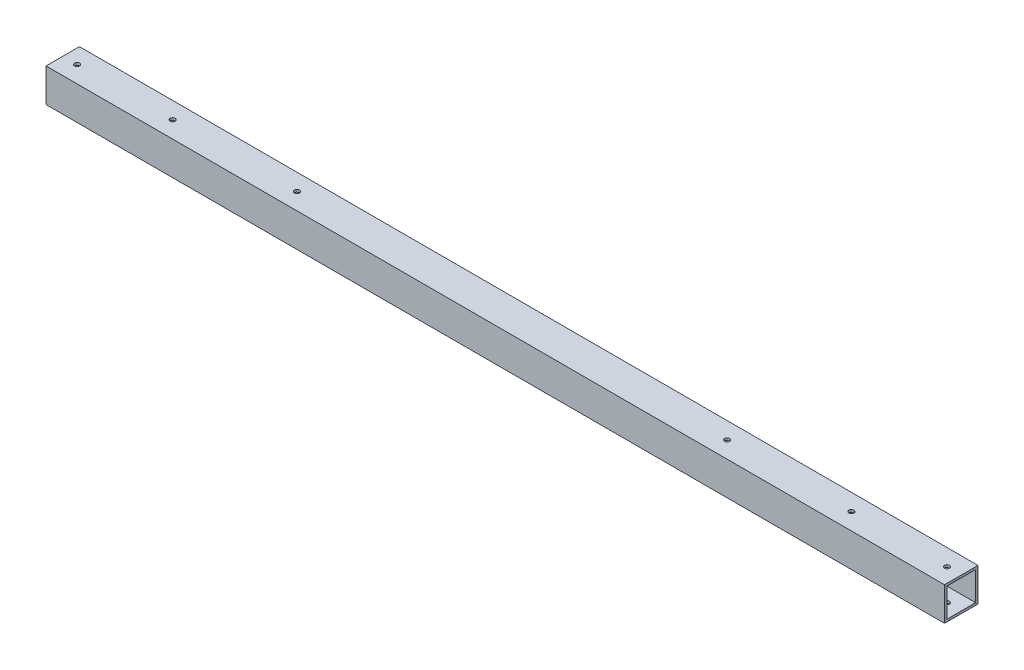
ISO-10303-21;
HEADER;
FILE_DESCRIPTION(('STEP AP214'),'2;1');
FILE_NAME('part.step','',(''),(''),'','','');
FILE_SCHEMA(('AUTOMOTIVE_DESIGN { 1 0 10303 214 1 1 1 1 }'));
ENDSEC;
DATA;
#1=APPLICATION_CONTEXT('core data for automotive mechanical design processes');
#2=APPLICATION_PROTOCOL_DEFINITION('international standard','automotive_design',2000,#1);
#3=PRODUCT_CONTEXT('',#1,'mechanical');
#4=PRODUCT('Part','Part','',(#3));
#5=PRODUCT_RELATED_PRODUCT_CATEGORY('part','',(#4));
#6=PRODUCT_DEFINITION_FORMATION('','',#4);
#7=PRODUCT_DEFINITION_CONTEXT('part definition',#1,'design');
#8=PRODUCT_DEFINITION('design','',#6,#7);
#9=PRODUCT_DEFINITION_SHAPE('','',#8);
#10=(LENGTH_UNIT() NAMED_UNIT(*) SI_UNIT(.MILLI.,.METRE.));
#11=(NAMED_UNIT(*) PLANE_ANGLE_UNIT() SI_UNIT($,.RADIAN.));
#12=(NAMED_UNIT(*) SI_UNIT($,.STERADIAN.) SOLID_ANGLE_UNIT());
#13=UNCERTAINTY_MEASURE_WITH_UNIT(LENGTH_MEASURE(1.E-05),#10,'distance_accuracy_value','');
#14=(GEOMETRIC_REPRESENTATION_CONTEXT(3) GLOBAL_UNCERTAINTY_ASSIGNED_CONTEXT((#13)) GLOBAL_UNIT_ASSIGNED_CONTEXT((#10,
#11,#12)) REPRESENTATION_CONTEXT('',''));
#15=CARTESIAN_POINT('',(0.,0.,0.));
#16=DIRECTION('',(0.,0.,1.));
#17=DIRECTION('',(1.,0.,0.));
#18=AXIS2_PLACEMENT_3D('',#15,#16,#17);
#19=CARTESIAN_POINT('',(1193.8,0.,0.));
#20=DIRECTION('',(-1.,0.,0.));
#21=DIRECTION('',(0.,0.,1.));
#22=AXIS2_PLACEMENT_3D('',#19,#20,#21);
#23=PLANE('',#22);
#24=DIRECTION('',(0.,1.,0.));
#25=VECTOR('',#24,1.);
#26=CARTESIAN_POINT('',(1193.8,-22.225,-22.225));
#27=LINE('',#26,#25);
#28=CARTESIAN_POINT('',(1193.8,-22.225,-22.225));
#29=VERTEX_POINT('',#28);
#30=CARTESIAN_POINT('',(1193.8,22.225,-22.225));
#31=VERTEX_POINT('',#30);
#32=EDGE_CURVE('E140',#29,#31,#27,.T.);
#33=ORIENTED_EDGE('',*,*,#32,.T.);
#34=DIRECTION('',(0.,0.,1.));
#35=VECTOR('',#34,1.);
#36=CARTESIAN_POINT('',(1193.8,22.225,22.225));
#37=LINE('',#36,#35);
#38=CARTESIAN_POINT('',(1193.8,22.225,22.225));
#39=VERTEX_POINT('',#38);
#40=EDGE_CURVE('E143',#31,#39,#37,.T.);
#41=ORIENTED_EDGE('',*,*,#40,.T.);
#42=DIRECTION('',(0.,-1.,0.));
#43=VECTOR('',#42,1.);
#44=CARTESIAN_POINT('',(1193.8,-22.225,22.225));
#45=LINE('',#44,#43);
#46=CARTESIAN_POINT('',(1193.8,-22.225,22.225));
#47=VERTEX_POINT('',#46);
#48=EDGE_CURVE('E146',#39,#47,#45,.T.);
#49=ORIENTED_EDGE('',*,*,#48,.T.);
#50=DIRECTION('',(0.,0.,-1.));
#51=VECTOR('',#50,1.);
#52=CARTESIAN_POINT('',(1193.8,-22.225,22.225));
#53=LINE('',#52,#51);
#54=EDGE_CURVE('E148',#47,#29,#53,.T.);
#55=ORIENTED_EDGE('',*,*,#54,.T.);
#56=EDGE_LOOP('',(#33,#41,#49,#55));
#57=FACE_BOUND('',#56,.T.);
#58=DIRECTION('',(0.,-1.,0.));
#59=VECTOR('',#58,1.);
#60=CARTESIAN_POINT('',(1193.8,-19.05,19.05));
#61=LINE('',#60,#59);
#62=CARTESIAN_POINT('',(1193.8,19.05,19.05));
#63=VERTEX_POINT('',#62);
#64=CARTESIAN_POINT('',(1193.8,-19.05,19.05));
#65=VERTEX_POINT('',#64);
#66=EDGE_CURVE('E102',#63,#65,#61,.T.);
#67=ORIENTED_EDGE('',*,*,#66,.F.);
#68=DIRECTION('',(0.,0.,1.));
#69=VECTOR('',#68,1.);
#70=CARTESIAN_POINT('',(1193.8,19.05,19.05));
#71=LINE('',#70,#69);
#72=CARTESIAN_POINT('',(1193.8,19.05,-19.05));
#73=VERTEX_POINT('',#72);
#74=EDGE_CURVE('E124',#73,#63,#71,.T.);
#75=ORIENTED_EDGE('',*,*,#74,.F.);
#76=DIRECTION('',(0.,1.,0.));
#77=VECTOR('',#76,1.);
#78=CARTESIAN_POINT('',(1193.8,-19.05,-19.05));
#79=LINE('',#78,#77);
#80=CARTESIAN_POINT('',(1193.8,-19.05,-19.05));
#81=VERTEX_POINT('',#80);
#82=EDGE_CURVE('E122',#81,#73,#79,.T.);
#83=ORIENTED_EDGE('',*,*,#82,.F.);
#84=DIRECTION('',(0.,0.,-1.));
#85=VECTOR('',#84,1.);
#86=CARTESIAN_POINT('',(1193.8,-19.05,19.05));
#87=LINE('',#86,#85);
#88=EDGE_CURVE('E110',#65,#81,#87,.T.);
#89=ORIENTED_EDGE('',*,*,#88,.F.);
#90=EDGE_LOOP('',(#67,#75,#83,#89));
#91=FACE_BOUND('',#90,.T.);
#92=ADVANCED_FACE('F35',(#57,#91),#23,.F.);
#93=CARTESIAN_POINT('',(0.,0.,0.));
#94=DIRECTION('',(-1.,0.,0.));
#95=DIRECTION('',(0.,0.,1.));
#96=AXIS2_PLACEMENT_3D('',#93,#94,#95);
#97=PLANE('',#96);
#98=DIRECTION('',(0.,1.,0.));
#99=VECTOR('',#98,1.);
#100=CARTESIAN_POINT('',(0.,-22.225,-22.225));
#101=LINE('',#100,#99);
#102=CARTESIAN_POINT('',(0.,-22.225,-22.225));
#103=VERTEX_POINT('',#102);
#104=CARTESIAN_POINT('',(0.,22.225,-22.225));
#105=VERTEX_POINT('',#104);
#106=EDGE_CURVE('E118',#103,#105,#101,.T.);
#107=ORIENTED_EDGE('',*,*,#106,.F.);
#108=DIRECTION('',(0.,0.,-1.));
#109=VECTOR('',#108,1.);
#110=CARTESIAN_POINT('',(0.,-22.225,22.225));
#111=LINE('',#110,#109);
#112=CARTESIAN_POINT('',(0.,-22.225,22.225));
#113=VERTEX_POINT('',#112);
#114=EDGE_CURVE('E144',#113,#103,#111,.T.);
#115=ORIENTED_EDGE('',*,*,#114,.F.);
#116=DIRECTION('',(0.,-1.,0.));
#117=VECTOR('',#116,1.);
#118=CARTESIAN_POINT('',(0.,-22.225,22.225));
#119=LINE('',#118,#117);
#120=CARTESIAN_POINT('',(0.,22.225,22.225));
#121=VERTEX_POINT('',#120);
#122=EDGE_CURVE('E155',#121,#113,#119,.T.);
#123=ORIENTED_EDGE('',*,*,#122,.F.);
#124=DIRECTION('',(0.,0.,1.));
#125=VECTOR('',#124,1.);
#126=CARTESIAN_POINT('',(0.,22.225,22.225));
#127=LINE('',#126,#125);
#128=EDGE_CURVE('E153',#105,#121,#127,.T.);
#129=ORIENTED_EDGE('',*,*,#128,.F.);
#130=EDGE_LOOP('',(#107,#115,#123,#129));
#131=FACE_BOUND('',#130,.T.);
#132=DIRECTION('',(0.,0.,1.));
#133=VECTOR('',#132,1.);
#134=CARTESIAN_POINT('',(0.,19.05,19.05));
#135=LINE('',#134,#133);
#136=CARTESIAN_POINT('',(0.,19.05,-19.05));
#137=VERTEX_POINT('',#136);
#138=CARTESIAN_POINT('',(0.,19.05,19.05));
#139=VERTEX_POINT('',#138);
#140=EDGE_CURVE('E111',#137,#139,#135,.T.);
#141=ORIENTED_EDGE('',*,*,#140,.T.);
#142=DIRECTION('',(0.,-1.,0.));
#143=VECTOR('',#142,1.);
#144=CARTESIAN_POINT('',(0.,-19.05,19.05));
#145=LINE('',#144,#143);
#146=CARTESIAN_POINT('',(0.,-19.05,19.05));
#147=VERTEX_POINT('',#146);
#148=EDGE_CURVE('E60',#139,#147,#145,.T.);
#149=ORIENTED_EDGE('',*,*,#148,.T.);
#150=DIRECTION('',(0.,0.,-1.));
#151=VECTOR('',#150,1.);
#152=CARTESIAN_POINT('',(0.,-19.05,19.05));
#153=LINE('',#152,#151);
#154=CARTESIAN_POINT('',(0.,-19.05,-19.05));
#155=VERTEX_POINT('',#154);
#156=EDGE_CURVE('E117',#147,#155,#153,.T.);
#157=ORIENTED_EDGE('',*,*,#156,.T.);
#158=DIRECTION('',(0.,1.,0.));
#159=VECTOR('',#158,1.);
#160=CARTESIAN_POINT('',(0.,-19.05,-19.05));
#161=LINE('',#160,#159);
#162=EDGE_CURVE('E132',#155,#137,#161,.T.);
#163=ORIENTED_EDGE('',*,*,#162,.T.);
#164=EDGE_LOOP('',(#141,#149,#157,#163));
#165=FACE_BOUND('',#164,.T.);
#166=ADVANCED_FACE('F239',(#131,#165),#97,.T.);
#167=CARTESIAN_POINT('',(1193.8,-22.225,-22.225));
#168=DIRECTION('',(0.,0.,1.));
#169=DIRECTION('',(1.,0.,0.));
#170=AXIS2_PLACEMENT_3D('',#167,#168,#169);
#171=PLANE('',#170);
#172=ORIENTED_EDGE('',*,*,#106,.T.);
#173=DIRECTION('',(-1.,0.,0.));
#174=VECTOR('',#173,1.);
#175=CARTESIAN_POINT('',(1193.8,22.225,-22.225));
#176=LINE('',#175,#174);
#177=EDGE_CURVE('E11',#31,#105,#176,.T.);
#178=ORIENTED_EDGE('',*,*,#177,.F.);
#179=ORIENTED_EDGE('',*,*,#32,.F.);
#180=DIRECTION('',(-1.,0.,0.));
#181=VECTOR('',#180,1.);
#182=CARTESIAN_POINT('',(1193.8,-22.225,-22.225));
#183=LINE('',#182,#181);
#184=EDGE_CURVE('E150',#29,#103,#183,.T.);
#185=ORIENTED_EDGE('',*,*,#184,.T.);
#186=EDGE_LOOP('',(#172,#178,#179,#185));
#187=FACE_BOUND('',#186,.T.);
#188=ADVANCED_FACE('F37',(#187),#171,.F.);
#189=CARTESIAN_POINT('',(1193.8,22.225,22.225));
#190=DIRECTION('',(0.,-1.,0.));
#191=DIRECTION('',(0.,0.,-1.));
#192=AXIS2_PLACEMENT_3D('',#189,#190,#191);
#193=PLANE('',#192);
#194=CARTESIAN_POINT('',(311.15,22.225,0.));
#195=DIRECTION('',(0.,1.,0.));
#196=DIRECTION('',(0.,0.,1.));
#197=AXIS2_PLACEMENT_3D('',#194,#195,#196);
#198=CIRCLE('',#197,3.3782);
#199=CARTESIAN_POINT('',(311.15,22.225,3.3782));
#200=VERTEX_POINT('',#199);
#201=EDGE_CURVE('E275',#200,#200,#198,.T.);
#202=ORIENTED_EDGE('',*,*,#201,.F.);
#203=EDGE_LOOP('',(#202));
#204=FACE_BOUND('',#203,.T.);
#205=CARTESIAN_POINT('',(146.05,22.225,0.));
#206=DIRECTION('',(0.,1.,0.));
#207=DIRECTION('',(0.,0.,1.));
#208=AXIS2_PLACEMENT_3D('',#205,#206,#207);
#209=CIRCLE('',#208,3.3782);
#210=CARTESIAN_POINT('',(146.05,22.225,3.3782));
#211=VERTEX_POINT('',#210);
#212=EDGE_CURVE('E189',#211,#211,#209,.T.);
#213=ORIENTED_EDGE('',*,*,#212,.F.);
#214=EDGE_LOOP('',(#213));
#215=FACE_BOUND('',#214,.T.);
#216=CARTESIAN_POINT('',(19.05,22.225,0.));
#217=DIRECTION('',(0.,1.,0.));
#218=DIRECTION('',(0.,0.,1.));
#219=AXIS2_PLACEMENT_3D('',#216,#217,#218);
#220=CIRCLE('',#219,3.3782);
#221=CARTESIAN_POINT('',(19.05,22.225,3.3782));
#222=VERTEX_POINT('',#221);
#223=EDGE_CURVE('E186',#222,#222,#220,.T.);
#224=ORIENTED_EDGE('',*,*,#223,.F.);
#225=EDGE_LOOP('',(#224));
#226=FACE_BOUND('',#225,.T.);
#227=CARTESIAN_POINT('',(1174.75,22.225,0.));
#228=DIRECTION('',(0.,1.,0.));
#229=DIRECTION('',(0.,0.,1.));
#230=AXIS2_PLACEMENT_3D('',#227,#228,#229);
#231=CIRCLE('',#230,3.3782);
#232=CARTESIAN_POINT('',(1174.75,22.225,3.3782));
#233=VERTEX_POINT('',#232);
#234=EDGE_CURVE('E204',#233,#233,#231,.T.);
#235=ORIENTED_EDGE('',*,*,#234,.F.);
#236=EDGE_LOOP('',(#235));
#237=FACE_BOUND('',#236,.T.);
#238=CARTESIAN_POINT('',(1047.75,22.225,0.));
#239=DIRECTION('',(0.,1.,0.));
#240=DIRECTION('',(0.,0.,1.));
#241=AXIS2_PLACEMENT_3D('',#238,#239,#240);
#242=CIRCLE('',#241,3.3782);
#243=CARTESIAN_POINT('',(1047.75,22.225,3.3782));
#244=VERTEX_POINT('',#243);
#245=EDGE_CURVE('E211',#244,#244,#242,.T.);
#246=ORIENTED_EDGE('',*,*,#245,.F.);
#247=EDGE_LOOP('',(#246));
#248=FACE_BOUND('',#247,.T.);
#249=CARTESIAN_POINT('',(882.65,22.225,0.));
#250=DIRECTION('',(0.,1.,0.));
#251=DIRECTION('',(0.,0.,1.));
#252=AXIS2_PLACEMENT_3D('',#249,#250,#251);
#253=CIRCLE('',#252,3.3782);
#254=CARTESIAN_POINT('',(882.65,22.225,3.3782));
#255=VERTEX_POINT('',#254);
#256=EDGE_CURVE('E218',#255,#255,#253,.T.);
#257=ORIENTED_EDGE('',*,*,#256,.F.);
#258=EDGE_LOOP('',(#257));
#259=FACE_BOUND('',#258,.T.);
#260=ORIENTED_EDGE('',*,*,#128,.T.);
#261=DIRECTION('',(-1.,0.,0.));
#262=VECTOR('',#261,1.);
#263=CARTESIAN_POINT('',(1193.8,22.225,22.225));
#264=LINE('',#263,#262);
#265=EDGE_CURVE('E44',#39,#121,#264,.T.);
#266=ORIENTED_EDGE('',*,*,#265,.F.);
#267=ORIENTED_EDGE('',*,*,#40,.F.);
#268=ORIENTED_EDGE('',*,*,#177,.T.);
#269=EDGE_LOOP('',(#260,#266,#267,#268));
#270=FACE_BOUND('',#269,.T.);
#271=ADVANCED_FACE('F264',(#204,#215,#226,#237,#248,#259,#270),#193,.F.);
#272=CARTESIAN_POINT('',(1193.8,-22.225,22.225));
#273=DIRECTION('',(0.,0.,-1.));
#274=DIRECTION('',(-1.,0.,0.));
#275=AXIS2_PLACEMENT_3D('',#272,#273,#274);
#276=PLANE('',#275);
#277=ORIENTED_EDGE('',*,*,#122,.T.);
#278=DIRECTION('',(-1.,0.,0.));
#279=VECTOR('',#278,1.);
#280=CARTESIAN_POINT('',(1193.8,-22.225,22.225));
#281=LINE('',#280,#279);
#282=EDGE_CURVE('E160',#47,#113,#281,.T.);
#283=ORIENTED_EDGE('',*,*,#282,.F.);
#284=ORIENTED_EDGE('',*,*,#48,.F.);
#285=ORIENTED_EDGE('',*,*,#265,.T.);
#286=EDGE_LOOP('',(#277,#283,#284,#285));
#287=FACE_BOUND('',#286,.T.);
#288=ADVANCED_FACE('F261',(#287),#276,.F.);
#289=CARTESIAN_POINT('',(1193.8,-22.225,22.225));
#290=DIRECTION('',(0.,1.,0.));
#291=DIRECTION('',(0.,0.,1.));
#292=AXIS2_PLACEMENT_3D('',#289,#290,#291);
#293=PLANE('',#292);
#294=CARTESIAN_POINT('',(311.15,-22.225,0.));
#295=DIRECTION('',(0.,1.,0.));
#296=DIRECTION('',(0.,0.,1.));
#297=AXIS2_PLACEMENT_3D('',#294,#295,#296);
#298=CIRCLE('',#297,3.3782);
#299=CARTESIAN_POINT('',(311.15,-22.225,3.3782));
#300=VERTEX_POINT('',#299);
#301=EDGE_CURVE('E339',#300,#300,#298,.T.);
#302=ORIENTED_EDGE('',*,*,#301,.T.);
#303=EDGE_LOOP('',(#302));
#304=FACE_BOUND('',#303,.T.);
#305=CARTESIAN_POINT('',(146.05,-22.225,0.));
#306=DIRECTION('',(0.,1.,0.));
#307=DIRECTION('',(0.,0.,1.));
#308=AXIS2_PLACEMENT_3D('',#305,#306,#307);
#309=CIRCLE('',#308,3.3782);
#310=CARTESIAN_POINT('',(146.05,-22.225,3.3782));
#311=VERTEX_POINT('',#310);
#312=EDGE_CURVE('E182',#311,#311,#309,.T.);
#313=ORIENTED_EDGE('',*,*,#312,.T.);
#314=EDGE_LOOP('',(#313));
#315=FACE_BOUND('',#314,.T.);
#316=CARTESIAN_POINT('',(19.05,-22.225,0.));
#317=DIRECTION('',(0.,1.,0.));
#318=DIRECTION('',(0.,0.,1.));
#319=AXIS2_PLACEMENT_3D('',#316,#317,#318);
#320=CIRCLE('',#319,3.37819999999999);
#321=CARTESIAN_POINT('',(19.05,-22.225,3.37819999999999));
#322=VERTEX_POINT('',#321);
#323=EDGE_CURVE('E178',#322,#322,#320,.T.);
#324=ORIENTED_EDGE('',*,*,#323,.T.);
#325=EDGE_LOOP('',(#324));
#326=FACE_BOUND('',#325,.T.);
#327=CARTESIAN_POINT('',(1174.75,-22.225,0.));
#328=DIRECTION('',(0.,1.,0.));
#329=DIRECTION('',(0.,0.,1.));
#330=AXIS2_PLACEMENT_3D('',#327,#328,#329);
#331=CIRCLE('',#330,3.3782);
#332=CARTESIAN_POINT('',(1174.75,-22.225,3.3782));
#333=VERTEX_POINT('',#332);
#334=EDGE_CURVE('E174',#333,#333,#331,.T.);
#335=ORIENTED_EDGE('',*,*,#334,.T.);
#336=EDGE_LOOP('',(#335));
#337=FACE_BOUND('',#336,.T.);
#338=CARTESIAN_POINT('',(1047.75,-22.225,0.));
#339=DIRECTION('',(0.,1.,0.));
#340=DIRECTION('',(0.,0.,1.));
#341=AXIS2_PLACEMENT_3D('',#338,#339,#340);
#342=CIRCLE('',#341,3.3782);
#343=CARTESIAN_POINT('',(1047.75,-22.225,3.3782));
#344=VERTEX_POINT('',#343);
#345=EDGE_CURVE('E169',#344,#344,#342,.T.);
#346=ORIENTED_EDGE('',*,*,#345,.T.);
#347=EDGE_LOOP('',(#346));
#348=FACE_BOUND('',#347,.T.);
#349=CARTESIAN_POINT('',(882.65,-22.225,0.));
#350=DIRECTION('',(0.,1.,0.));
#351=DIRECTION('',(0.,0.,1.));
#352=AXIS2_PLACEMENT_3D('',#349,#350,#351);
#353=CIRCLE('',#352,3.3782);
#354=CARTESIAN_POINT('',(882.65,-22.225,3.3782));
#355=VERTEX_POINT('',#354);
#356=EDGE_CURVE('E221',#355,#355,#353,.T.);
#357=ORIENTED_EDGE('',*,*,#356,.T.);
#358=EDGE_LOOP('',(#357));
#359=FACE_BOUND('',#358,.T.);
#360=ORIENTED_EDGE('',*,*,#114,.T.);
#361=ORIENTED_EDGE('',*,*,#184,.F.);
#362=ORIENTED_EDGE('',*,*,#54,.F.);
#363=ORIENTED_EDGE('',*,*,#282,.T.);
#364=EDGE_LOOP('',(#360,#361,#362,#363));
#365=FACE_BOUND('',#364,.T.);
#366=ADVANCED_FACE('F258',(#304,#315,#326,#337,#348,#359,#365),#293,.F.);
#367=CARTESIAN_POINT('',(1193.8,-19.05,19.05));
#368=DIRECTION('',(0.,0.,-1.));
#369=DIRECTION('',(-1.,0.,0.));
#370=AXIS2_PLACEMENT_3D('',#367,#368,#369);
#371=PLANE('',#370);
#372=ORIENTED_EDGE('',*,*,#148,.F.);
#373=DIRECTION('',(-1.,0.,0.));
#374=VECTOR('',#373,1.);
#375=CARTESIAN_POINT('',(1193.8,19.05,19.05));
#376=LINE('',#375,#374);
#377=EDGE_CURVE('E106',#63,#139,#376,.T.);
#378=ORIENTED_EDGE('',*,*,#377,.F.);
#379=ORIENTED_EDGE('',*,*,#66,.T.);
#380=DIRECTION('',(-1.,0.,0.));
#381=VECTOR('',#380,1.);
#382=CARTESIAN_POINT('',(1193.8,-19.05,19.05));
#383=LINE('',#382,#381);
#384=EDGE_CURVE('E105',#65,#147,#383,.T.);
#385=ORIENTED_EDGE('',*,*,#384,.T.);
#386=EDGE_LOOP('',(#372,#378,#379,#385));
#387=FACE_BOUND('',#386,.T.);
#388=ADVANCED_FACE('F104',(#387),#371,.T.);
#389=CARTESIAN_POINT('',(1193.8,-19.05,19.05));
#390=DIRECTION('',(0.,1.,0.));
#391=DIRECTION('',(0.,0.,1.));
#392=AXIS2_PLACEMENT_3D('',#389,#390,#391);
#393=PLANE('',#392);
#394=CARTESIAN_POINT('',(311.15,-19.05,0.));
#395=DIRECTION('',(0.,1.,0.));
#396=DIRECTION('',(0.,0.,1.));
#397=AXIS2_PLACEMENT_3D('',#394,#395,#396);
#398=CIRCLE('',#397,3.3782);
#399=CARTESIAN_POINT('',(311.15,-19.05,3.3782));
#400=VERTEX_POINT('',#399);
#401=EDGE_CURVE('E39',#400,#400,#398,.T.);
#402=ORIENTED_EDGE('',*,*,#401,.F.);
#403=EDGE_LOOP('',(#402));
#404=FACE_BOUND('',#403,.T.);
#405=CARTESIAN_POINT('',(146.05,-19.05,0.));
#406=DIRECTION('',(0.,1.,0.));
#407=DIRECTION('',(0.,0.,1.));
#408=AXIS2_PLACEMENT_3D('',#405,#406,#407);
#409=CIRCLE('',#408,3.3782);
#410=CARTESIAN_POINT('',(146.05,-19.05,3.3782));
#411=VERTEX_POINT('',#410);
#412=EDGE_CURVE('E181',#411,#411,#409,.T.);
#413=ORIENTED_EDGE('',*,*,#412,.F.);
#414=EDGE_LOOP('',(#413));
#415=FACE_BOUND('',#414,.T.);
#416=CARTESIAN_POINT('',(19.05,-19.05,0.));
#417=DIRECTION('',(0.,1.,0.));
#418=DIRECTION('',(0.,0.,1.));
#419=AXIS2_PLACEMENT_3D('',#416,#417,#418);
#420=CIRCLE('',#419,3.3782);
#421=CARTESIAN_POINT('',(19.05,-19.05,3.3782));
#422=VERTEX_POINT('',#421);
#423=EDGE_CURVE('E175',#422,#422,#420,.T.);
#424=ORIENTED_EDGE('',*,*,#423,.F.);
#425=EDGE_LOOP('',(#424));
#426=FACE_BOUND('',#425,.T.);
#427=CARTESIAN_POINT('',(1174.75,-19.05,0.));
#428=DIRECTION('',(0.,1.,0.));
#429=DIRECTION('',(0.,0.,1.));
#430=AXIS2_PLACEMENT_3D('',#427,#428,#429);
#431=CIRCLE('',#430,3.3782);
#432=CARTESIAN_POINT('',(1174.75,-19.05,3.3782));
#433=VERTEX_POINT('',#432);
#434=EDGE_CURVE('E173',#433,#433,#431,.T.);
#435=ORIENTED_EDGE('',*,*,#434,.F.);
#436=EDGE_LOOP('',(#435));
#437=FACE_BOUND('',#436,.T.);
#438=CARTESIAN_POINT('',(1047.75,-19.05,0.));
#439=DIRECTION('',(0.,1.,0.));
#440=DIRECTION('',(0.,0.,1.));
#441=AXIS2_PLACEMENT_3D('',#438,#439,#440);
#442=CIRCLE('',#441,3.3782);
#443=CARTESIAN_POINT('',(1047.75,-19.05,3.3782));
#444=VERTEX_POINT('',#443);
#445=EDGE_CURVE('E168',#444,#444,#442,.T.);
#446=ORIENTED_EDGE('',*,*,#445,.F.);
#447=EDGE_LOOP('',(#446));
#448=FACE_BOUND('',#447,.T.);
#449=CARTESIAN_POINT('',(882.65,-19.05,0.));
#450=DIRECTION('',(0.,1.,0.));
#451=DIRECTION('',(0.,0.,1.));
#452=AXIS2_PLACEMENT_3D('',#449,#450,#451);
#453=CIRCLE('',#452,3.3782);
#454=CARTESIAN_POINT('',(882.65,-19.05,3.3782));
#455=VERTEX_POINT('',#454);
#456=EDGE_CURVE('E224',#455,#455,#453,.T.);
#457=ORIENTED_EDGE('',*,*,#456,.F.);
#458=EDGE_LOOP('',(#457));
#459=FACE_BOUND('',#458,.T.);
#460=ORIENTED_EDGE('',*,*,#156,.F.);
#461=ORIENTED_EDGE('',*,*,#384,.F.);
#462=ORIENTED_EDGE('',*,*,#88,.T.);
#463=DIRECTION('',(-1.,0.,0.));
#464=VECTOR('',#463,1.);
#465=CARTESIAN_POINT('',(1193.8,-19.05,-19.05));
#466=LINE('',#465,#464);
#467=EDGE_CURVE('E119',#81,#155,#466,.T.);
#468=ORIENTED_EDGE('',*,*,#467,.T.);
#469=EDGE_LOOP('',(#460,#461,#462,#468));
#470=FACE_BOUND('',#469,.T.);
#471=ADVANCED_FACE('F114',(#404,#415,#426,#437,#448,#459,#470),#393,.T.);
#472=CARTESIAN_POINT('',(1193.8,-19.05,-19.05));
#473=DIRECTION('',(0.,0.,1.));
#474=DIRECTION('',(0.,-1.,0.));
#475=AXIS2_PLACEMENT_3D('',#472,#473,#474);
#476=PLANE('',#475);
#477=ORIENTED_EDGE('',*,*,#162,.F.);
#478=ORIENTED_EDGE('',*,*,#467,.F.);
#479=ORIENTED_EDGE('',*,*,#82,.T.);
#480=DIRECTION('',(-1.,0.,0.));
#481=VECTOR('',#480,1.);
#482=CARTESIAN_POINT('',(1193.8,19.05,-19.05));
#483=LINE('',#482,#481);
#484=EDGE_CURVE('E52',#73,#137,#483,.T.);
#485=ORIENTED_EDGE('',*,*,#484,.T.);
#486=EDGE_LOOP('',(#477,#478,#479,#485));
#487=FACE_BOUND('',#486,.T.);
#488=ADVANCED_FACE('F234',(#487),#476,.T.);
#489=CARTESIAN_POINT('',(1193.8,19.05,19.05));
#490=DIRECTION('',(0.,-1.,0.));
#491=DIRECTION('',(0.,0.,-1.));
#492=AXIS2_PLACEMENT_3D('',#489,#490,#491);
#493=PLANE('',#492);
#494=CARTESIAN_POINT('',(311.15,19.05,0.));
#495=DIRECTION('',(0.,-1.,0.));
#496=DIRECTION('',(0.,0.,-1.));
#497=AXIS2_PLACEMENT_3D('',#494,#495,#496);
#498=CIRCLE('',#497,3.3782);
#499=CARTESIAN_POINT('',(311.15,19.05,-3.3782));
#500=VERTEX_POINT('',#499);
#501=EDGE_CURVE('E194',#500,#500,#498,.T.);
#502=ORIENTED_EDGE('',*,*,#501,.F.);
#503=EDGE_LOOP('',(#502));
#504=FACE_BOUND('',#503,.T.);
#505=CARTESIAN_POINT('',(146.05,19.05,0.));
#506=DIRECTION('',(0.,-1.,0.));
#507=DIRECTION('',(0.,0.,-1.));
#508=AXIS2_PLACEMENT_3D('',#505,#506,#507);
#509=CIRCLE('',#508,3.3782);
#510=CARTESIAN_POINT('',(146.05,19.05,-3.3782));
#511=VERTEX_POINT('',#510);
#512=EDGE_CURVE('E179',#511,#511,#509,.T.);
#513=ORIENTED_EDGE('',*,*,#512,.F.);
#514=EDGE_LOOP('',(#513));
#515=FACE_BOUND('',#514,.T.);
#516=CARTESIAN_POINT('',(19.05,19.05,0.));
#517=DIRECTION('',(0.,-1.,0.));
#518=DIRECTION('',(0.,0.,-1.));
#519=AXIS2_PLACEMENT_3D('',#516,#517,#518);
#520=CIRCLE('',#519,3.3782);
#521=CARTESIAN_POINT('',(19.05,19.05,-3.3782));
#522=VERTEX_POINT('',#521);
#523=EDGE_CURVE('E177',#522,#522,#520,.T.);
#524=ORIENTED_EDGE('',*,*,#523,.F.);
#525=EDGE_LOOP('',(#524));
#526=FACE_BOUND('',#525,.T.);
#527=CARTESIAN_POINT('',(1174.75,19.05,0.));
#528=DIRECTION('',(0.,-1.,0.));
#529=DIRECTION('',(0.,0.,-1.));
#530=AXIS2_PLACEMENT_3D('',#527,#528,#529);
#531=CIRCLE('',#530,3.3782);
#532=CARTESIAN_POINT('',(1174.75,19.05,-3.3782));
#533=VERTEX_POINT('',#532);
#534=EDGE_CURVE('E170',#533,#533,#531,.T.);
#535=ORIENTED_EDGE('',*,*,#534,.F.);
#536=EDGE_LOOP('',(#535));
#537=FACE_BOUND('',#536,.T.);
#538=CARTESIAN_POINT('',(1047.75,19.05,0.));
#539=DIRECTION('',(0.,-1.,0.));
#540=DIRECTION('',(0.,0.,-1.));
#541=AXIS2_PLACEMENT_3D('',#538,#539,#540);
#542=CIRCLE('',#541,3.3782);
#543=CARTESIAN_POINT('',(1047.75,19.05,-3.3782));
#544=VERTEX_POINT('',#543);
#545=EDGE_CURVE('E165',#544,#544,#542,.T.);
#546=ORIENTED_EDGE('',*,*,#545,.F.);
#547=EDGE_LOOP('',(#546));
#548=FACE_BOUND('',#547,.T.);
#549=CARTESIAN_POINT('',(882.65,19.05,0.));
#550=DIRECTION('',(0.,-1.,0.));
#551=DIRECTION('',(0.,0.,-1.));
#552=AXIS2_PLACEMENT_3D('',#549,#550,#551);
#553=CIRCLE('',#552,3.3782);
#554=CARTESIAN_POINT('',(882.65,19.05,-3.3782));
#555=VERTEX_POINT('',#554);
#556=EDGE_CURVE('E130',#555,#555,#553,.T.);
#557=ORIENTED_EDGE('',*,*,#556,.F.);
#558=EDGE_LOOP('',(#557));
#559=FACE_BOUND('',#558,.T.);
#560=ORIENTED_EDGE('',*,*,#140,.F.);
#561=ORIENTED_EDGE('',*,*,#484,.F.);
#562=ORIENTED_EDGE('',*,*,#74,.T.);
#563=ORIENTED_EDGE('',*,*,#377,.T.);
#564=EDGE_LOOP('',(#560,#561,#562,#563));
#565=FACE_BOUND('',#564,.T.);
#566=ADVANCED_FACE('F232',(#504,#515,#526,#537,#548,#559,#565),#493,.T.);
#567=CARTESIAN_POINT('',(882.65,22.225,0.));
#568=DIRECTION('',(0.,1.,0.));
#569=DIRECTION('',(0.,0.,1.));
#570=AXIS2_PLACEMENT_3D('',#567,#568,#569);
#571=CYLINDRICAL_SURFACE('',#570,3.3782);
#572=ORIENTED_EDGE('',*,*,#556,.T.);
#573=EDGE_LOOP('',(#572));
#574=FACE_BOUND('',#573,.T.);
#575=ORIENTED_EDGE('',*,*,#256,.T.);
#576=EDGE_LOOP('',(#575));
#577=FACE_BOUND('',#576,.T.);
#578=ADVANCED_FACE('F229',(#574,#577),#571,.F.);
#579=ORIENTED_EDGE('',*,*,#456,.T.);
#580=EDGE_LOOP('',(#579));
#581=FACE_BOUND('',#580,.T.);
#582=ORIENTED_EDGE('',*,*,#356,.F.);
#583=EDGE_LOOP('',(#582));
#584=FACE_BOUND('',#583,.T.);
#585=ADVANCED_FACE('F298',(#581,#584),#571,.F.);
#586=CARTESIAN_POINT('',(1047.75,22.225,0.));
#587=DIRECTION('',(0.,1.,0.));
#588=DIRECTION('',(0.,0.,1.));
#589=AXIS2_PLACEMENT_3D('',#586,#587,#588);
#590=CYLINDRICAL_SURFACE('',#589,3.3782);
#591=ORIENTED_EDGE('',*,*,#545,.T.);
#592=EDGE_LOOP('',(#591));
#593=FACE_BOUND('',#592,.T.);
#594=ORIENTED_EDGE('',*,*,#245,.T.);
#595=EDGE_LOOP('',(#594));
#596=FACE_BOUND('',#595,.T.);
#597=ADVANCED_FACE('F303',(#593,#596),#590,.F.);
#598=ORIENTED_EDGE('',*,*,#445,.T.);
#599=EDGE_LOOP('',(#598));
#600=FACE_BOUND('',#599,.T.);
#601=ORIENTED_EDGE('',*,*,#345,.F.);
#602=EDGE_LOOP('',(#601));
#603=FACE_BOUND('',#602,.T.);
#604=ADVANCED_FACE('F308',(#600,#603),#590,.F.);
#605=CARTESIAN_POINT('',(1174.75,22.225,0.));
#606=DIRECTION('',(0.,1.,0.));
#607=DIRECTION('',(0.,0.,1.));
#608=AXIS2_PLACEMENT_3D('',#605,#606,#607);
#609=CYLINDRICAL_SURFACE('',#608,3.3782);
#610=ORIENTED_EDGE('',*,*,#534,.T.);
#611=EDGE_LOOP('',(#610));
#612=FACE_BOUND('',#611,.T.);
#613=ORIENTED_EDGE('',*,*,#234,.T.);
#614=EDGE_LOOP('',(#613));
#615=FACE_BOUND('',#614,.T.);
#616=ADVANCED_FACE('F310',(#612,#615),#609,.F.);
#617=ORIENTED_EDGE('',*,*,#434,.T.);
#618=EDGE_LOOP('',(#617));
#619=FACE_BOUND('',#618,.T.);
#620=ORIENTED_EDGE('',*,*,#334,.F.);
#621=EDGE_LOOP('',(#620));
#622=FACE_BOUND('',#621,.T.);
#623=ADVANCED_FACE('F313',(#619,#622),#609,.F.);
#624=CARTESIAN_POINT('',(19.05,22.225,0.));
#625=DIRECTION('',(0.,1.,0.));
#626=DIRECTION('',(0.,0.,1.));
#627=AXIS2_PLACEMENT_3D('',#624,#625,#626);
#628=CYLINDRICAL_SURFACE('',#627,3.3782);
#629=ORIENTED_EDGE('',*,*,#423,.T.);
#630=EDGE_LOOP('',(#629));
#631=FACE_BOUND('',#630,.T.);
#632=ORIENTED_EDGE('',*,*,#323,.F.);
#633=EDGE_LOOP('',(#632));
#634=FACE_BOUND('',#633,.T.);
#635=ADVANCED_FACE('F315',(#631,#634),#628,.F.);
#636=ORIENTED_EDGE('',*,*,#523,.T.);
#637=EDGE_LOOP('',(#636));
#638=FACE_BOUND('',#637,.T.);
#639=ORIENTED_EDGE('',*,*,#223,.T.);
#640=EDGE_LOOP('',(#639));
#641=FACE_BOUND('',#640,.T.);
#642=ADVANCED_FACE('F318',(#638,#641),#628,.F.);
#643=CARTESIAN_POINT('',(146.05,22.225,0.));
#644=DIRECTION('',(0.,1.,0.));
#645=DIRECTION('',(0.,0.,1.));
#646=AXIS2_PLACEMENT_3D('',#643,#644,#645);
#647=CYLINDRICAL_SURFACE('',#646,3.3782);
#648=ORIENTED_EDGE('',*,*,#512,.T.);
#649=EDGE_LOOP('',(#648));
#650=FACE_BOUND('',#649,.T.);
#651=ORIENTED_EDGE('',*,*,#212,.T.);
#652=EDGE_LOOP('',(#651));
#653=FACE_BOUND('',#652,.T.);
#654=ADVANCED_FACE('F320',(#650,#653),#647,.F.);
#655=ORIENTED_EDGE('',*,*,#412,.T.);
#656=EDGE_LOOP('',(#655));
#657=FACE_BOUND('',#656,.T.);
#658=ORIENTED_EDGE('',*,*,#312,.F.);
#659=EDGE_LOOP('',(#658));
#660=FACE_BOUND('',#659,.T.);
#661=ADVANCED_FACE('F323',(#657,#660),#647,.F.);
#662=CARTESIAN_POINT('',(311.15,22.225,0.));
#663=DIRECTION('',(0.,1.,0.));
#664=DIRECTION('',(0.,0.,1.));
#665=AXIS2_PLACEMENT_3D('',#662,#663,#664);
#666=CYLINDRICAL_SURFACE('',#665,3.3782);
#667=ORIENTED_EDGE('',*,*,#401,.T.);
#668=EDGE_LOOP('',(#667));
#669=FACE_BOUND('',#668,.T.);
#670=ORIENTED_EDGE('',*,*,#301,.F.);
#671=EDGE_LOOP('',(#670));
#672=FACE_BOUND('',#671,.T.);
#673=ADVANCED_FACE('F324',(#669,#672),#666,.F.);
#674=ORIENTED_EDGE('',*,*,#501,.T.);
#675=EDGE_LOOP('',(#674));
#676=FACE_BOUND('',#675,.T.);
#677=ORIENTED_EDGE('',*,*,#201,.T.);
#678=EDGE_LOOP('',(#677));
#679=FACE_BOUND('',#678,.T.);
#680=ADVANCED_FACE('F326',(#676,#679),#666,.F.);
#681=CLOSED_SHELL('',(#92,#166,#188,#271,#288,#366,#388,#471,#488,#566,#578,#585,#597,#604,#616,
#623,#635,#642,#654,#661,#673,#680));
#682=MANIFOLD_SOLID_BREP('B2',#681);
#683=ADVANCED_BREP_SHAPE_REPRESENTATION('',(#18,#682),#14);
#684=SHAPE_DEFINITION_REPRESENTATION(#9,#683);
ENDSEC;
END-ISO-10303-21;
